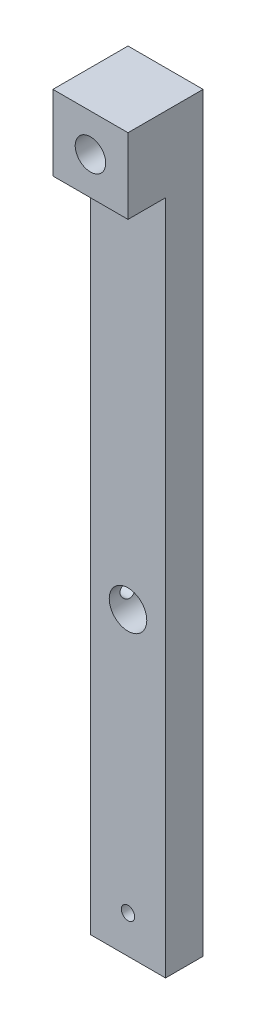
ISO-10303-21;
HEADER;
FILE_DESCRIPTION(('STEP AP214'),'2;1');
FILE_NAME('part.step','',(''),(''),'','','');
FILE_SCHEMA(('AUTOMOTIVE_DESIGN { 1 0 10303 214 1 1 1 1 }'));
ENDSEC;
DATA;
#1=APPLICATION_CONTEXT('core data for automotive mechanical design processes');
#2=APPLICATION_PROTOCOL_DEFINITION('international standard','automotive_design',2000,#1);
#3=PRODUCT_CONTEXT('',#1,'mechanical');
#4=PRODUCT('Part','Part','',(#3));
#5=PRODUCT_RELATED_PRODUCT_CATEGORY('part','',(#4));
#6=PRODUCT_DEFINITION_FORMATION('','',#4);
#7=PRODUCT_DEFINITION_CONTEXT('part definition',#1,'design');
#8=PRODUCT_DEFINITION('design','',#6,#7);
#9=PRODUCT_DEFINITION_SHAPE('','',#8);
#10=(LENGTH_UNIT() NAMED_UNIT(*) SI_UNIT(.MILLI.,.METRE.));
#11=(NAMED_UNIT(*) PLANE_ANGLE_UNIT() SI_UNIT($,.RADIAN.));
#12=(NAMED_UNIT(*) SI_UNIT($,.STERADIAN.) SOLID_ANGLE_UNIT());
#13=UNCERTAINTY_MEASURE_WITH_UNIT(LENGTH_MEASURE(1.E-05),#10,'distance_accuracy_value','');
#14=(GEOMETRIC_REPRESENTATION_CONTEXT(3) GLOBAL_UNCERTAINTY_ASSIGNED_CONTEXT((#13)) GLOBAL_UNIT_ASSIGNED_CONTEXT((#10,
#11,#12)) REPRESENTATION_CONTEXT('',''));
#15=CARTESIAN_POINT('',(0.,0.,0.));
#16=DIRECTION('',(0.,0.,1.));
#17=DIRECTION('',(1.,0.,0.));
#18=AXIS2_PLACEMENT_3D('',#15,#16,#17);
#19=CARTESIAN_POINT('',(6.34999999999999,63.5,6.35));
#20=DIRECTION('',(-1.,0.,0.));
#21=DIRECTION('',(0.,-1.,0.));
#22=AXIS2_PLACEMENT_3D('',#19,#20,#21);
#23=PLANE('',#22);
#24=DIRECTION('',(0.,1.,0.));
#25=VECTOR('',#24,1.);
#26=CARTESIAN_POINT('',(6.34999999999999,63.5,0.));
#27=LINE('',#26,#25);
#28=CARTESIAN_POINT('',(6.35,-63.5,0.));
#29=VERTEX_POINT('',#28);
#30=CARTESIAN_POINT('',(6.34999999999999,63.5,0.));
#31=VERTEX_POINT('',#30);
#32=EDGE_CURVE('E95',#29,#31,#27,.T.);
#33=ORIENTED_EDGE('',*,*,#32,.T.);
#34=DIRECTION('',(0.,0.,-1.));
#35=VECTOR('',#34,1.);
#36=CARTESIAN_POINT('',(6.34999999999999,63.5,6.35));
#37=LINE('',#36,#35);
#38=CARTESIAN_POINT('',(6.35,63.5,12.7));
#39=VERTEX_POINT('',#38);
#40=EDGE_CURVE('E12',#39,#31,#37,.T.);
#41=ORIENTED_EDGE('',*,*,#40,.F.);
#42=DIRECTION('',(0.,1.,0.));
#43=VECTOR('',#42,1.);
#44=CARTESIAN_POINT('',(6.35,63.5,12.7));
#45=LINE('',#44,#43);
#46=CARTESIAN_POINT('',(6.35,50.8,12.7));
#47=VERTEX_POINT('',#46);
#48=EDGE_CURVE('E134',#47,#39,#45,.T.);
#49=ORIENTED_EDGE('',*,*,#48,.F.);
#50=DIRECTION('',(0.,0.,-1.));
#51=VECTOR('',#50,1.);
#52=CARTESIAN_POINT('',(6.35,50.8,12.7));
#53=LINE('',#52,#51);
#54=CARTESIAN_POINT('',(6.35,50.8,6.35));
#55=VERTEX_POINT('',#54);
#56=EDGE_CURVE('E104',#47,#55,#53,.T.);
#57=ORIENTED_EDGE('',*,*,#56,.T.);
#58=DIRECTION('',(0.,1.,0.));
#59=VECTOR('',#58,1.);
#60=CARTESIAN_POINT('',(6.34999999999999,63.5,6.35));
#61=LINE('',#60,#59);
#62=CARTESIAN_POINT('',(6.35,-63.5,6.35));
#63=VERTEX_POINT('',#62);
#64=EDGE_CURVE('E89',#63,#55,#61,.T.);
#65=ORIENTED_EDGE('',*,*,#64,.F.);
#66=DIRECTION('',(0.,0.,-1.));
#67=VECTOR('',#66,1.);
#68=CARTESIAN_POINT('',(6.35,-63.5,6.35));
#69=LINE('',#68,#67);
#70=EDGE_CURVE('E82',#63,#29,#69,.T.);
#71=ORIENTED_EDGE('',*,*,#70,.T.);
#72=EDGE_LOOP('',(#33,#41,#49,#57,#65,#71));
#73=FACE_BOUND('',#72,.T.);
#74=ADVANCED_FACE('F38',(#73),#23,.F.);
#75=CARTESIAN_POINT('',(-6.35000000000001,63.5,6.35));
#76=DIRECTION('',(0.,-1.,0.));
#77=DIRECTION('',(0.,0.,-1.));
#78=AXIS2_PLACEMENT_3D('',#75,#76,#77);
#79=PLANE('',#78);
#80=DIRECTION('',(-1.,0.,0.));
#81=VECTOR('',#80,1.);
#82=CARTESIAN_POINT('',(-6.35000000000001,63.5,0.));
#83=LINE('',#82,#81);
#84=CARTESIAN_POINT('',(-6.35000000000001,63.5,0.));
#85=VERTEX_POINT('',#84);
#86=EDGE_CURVE('E99',#31,#85,#83,.T.);
#87=ORIENTED_EDGE('',*,*,#86,.T.);
#88=DIRECTION('',(0.,0.,-1.));
#89=VECTOR('',#88,1.);
#90=CARTESIAN_POINT('',(-6.35000000000001,63.5,6.35));
#91=LINE('',#90,#89);
#92=CARTESIAN_POINT('',(-6.35000000000001,63.5,12.7));
#93=VERTEX_POINT('',#92);
#94=EDGE_CURVE('E46',#93,#85,#91,.T.);
#95=ORIENTED_EDGE('',*,*,#94,.F.);
#96=DIRECTION('',(-1.,0.,0.));
#97=VECTOR('',#96,1.);
#98=CARTESIAN_POINT('',(-6.35000000000001,63.5,12.7));
#99=LINE('',#98,#97);
#100=EDGE_CURVE('E122',#39,#93,#99,.T.);
#101=ORIENTED_EDGE('',*,*,#100,.F.);
#102=ORIENTED_EDGE('',*,*,#40,.T.);
#103=EDGE_LOOP('',(#87,#95,#101,#102));
#104=FACE_BOUND('',#103,.T.);
#105=ADVANCED_FACE('F183',(#104),#79,.F.);
#106=CARTESIAN_POINT('',(-6.35000000000001,63.5,6.35));
#107=DIRECTION('',(1.,0.,0.));
#108=DIRECTION('',(0.,1.,0.));
#109=AXIS2_PLACEMENT_3D('',#106,#107,#108);
#110=PLANE('',#109);
#111=CARTESIAN_POINT('',(-6.35,-12.7,3.175));
#112=DIRECTION('',(-1.,0.,0.));
#113=DIRECTION('',(0.,0.,1.));
#114=AXIS2_PLACEMENT_3D('',#111,#112,#113);
#115=CIRCLE('',#114,1.35255);
#116=CARTESIAN_POINT('',(-6.35,-12.7,4.52755));
#117=VERTEX_POINT('',#116);
#118=EDGE_CURVE('E167',#117,#117,#115,.T.);
#119=ORIENTED_EDGE('',*,*,#118,.F.);
#120=EDGE_LOOP('',(#119));
#121=FACE_BOUND('',#120,.T.);
#122=DIRECTION('',(0.,-1.,0.));
#123=VECTOR('',#122,1.);
#124=CARTESIAN_POINT('',(-6.35000000000001,63.5,0.));
#125=LINE('',#124,#123);
#126=CARTESIAN_POINT('',(-6.35,-63.5,0.));
#127=VERTEX_POINT('',#126);
#128=EDGE_CURVE('E90',#85,#127,#125,.T.);
#129=ORIENTED_EDGE('',*,*,#128,.T.);
#130=DIRECTION('',(0.,0.,-1.));
#131=VECTOR('',#130,1.);
#132=CARTESIAN_POINT('',(-6.35,-63.5,6.35));
#133=LINE('',#132,#131);
#134=CARTESIAN_POINT('',(-6.35,-63.5,6.35));
#135=VERTEX_POINT('',#134);
#136=EDGE_CURVE('E85',#135,#127,#133,.T.);
#137=ORIENTED_EDGE('',*,*,#136,.F.);
#138=DIRECTION('',(0.,-1.,0.));
#139=VECTOR('',#138,1.);
#140=CARTESIAN_POINT('',(-6.35000000000001,63.5,6.35));
#141=LINE('',#140,#139);
#142=CARTESIAN_POINT('',(-6.35000000000001,50.8,6.35));
#143=VERTEX_POINT('',#142);
#144=EDGE_CURVE('E115',#143,#135,#141,.T.);
#145=ORIENTED_EDGE('',*,*,#144,.F.);
#146=DIRECTION('',(0.,0.,-1.));
#147=VECTOR('',#146,1.);
#148=CARTESIAN_POINT('',(-6.35000000000001,50.8,12.7));
#149=LINE('',#148,#147);
#150=CARTESIAN_POINT('',(-6.35000000000001,50.8,12.7));
#151=VERTEX_POINT('',#150);
#152=EDGE_CURVE('E100',#151,#143,#149,.T.);
#153=ORIENTED_EDGE('',*,*,#152,.F.);
#154=DIRECTION('',(0.,-1.,0.));
#155=VECTOR('',#154,1.);
#156=CARTESIAN_POINT('',(-6.35000000000001,63.5,12.7));
#157=LINE('',#156,#155);
#158=EDGE_CURVE('E125',#93,#151,#157,.T.);
#159=ORIENTED_EDGE('',*,*,#158,.F.);
#160=ORIENTED_EDGE('',*,*,#94,.T.);
#161=EDGE_LOOP('',(#129,#137,#145,#153,#159,#160));
#162=FACE_BOUND('',#161,.T.);
#163=ADVANCED_FACE('F187',(#121,#162),#110,.F.);
#164=CARTESIAN_POINT('',(-6.35,-63.5,6.35));
#165=DIRECTION('',(0.,1.,0.));
#166=DIRECTION('',(0.,0.,1.));
#167=AXIS2_PLACEMENT_3D('',#164,#165,#166);
#168=PLANE('',#167);
#169=DIRECTION('',(1.,0.,0.));
#170=VECTOR('',#169,1.);
#171=CARTESIAN_POINT('',(-6.35,-63.5,0.));
#172=LINE('',#171,#170);
#173=EDGE_CURVE('E79',#127,#29,#172,.T.);
#174=ORIENTED_EDGE('',*,*,#173,.T.);
#175=ORIENTED_EDGE('',*,*,#70,.F.);
#176=DIRECTION('',(1.,0.,0.));
#177=VECTOR('',#176,1.);
#178=CARTESIAN_POINT('',(-6.35,-63.5,6.35));
#179=LINE('',#178,#177);
#180=EDGE_CURVE('E60',#135,#63,#179,.T.);
#181=ORIENTED_EDGE('',*,*,#180,.F.);
#182=ORIENTED_EDGE('',*,*,#136,.T.);
#183=EDGE_LOOP('',(#174,#175,#181,#182));
#184=FACE_BOUND('',#183,.T.);
#185=ADVANCED_FACE('F81',(#184),#168,.F.);
#186=CARTESIAN_POINT('',(6.35,-63.5,6.35));
#187=DIRECTION('',(0.,0.,1.));
#188=DIRECTION('',(1.,0.,0.));
#189=AXIS2_PLACEMENT_3D('',#186,#187,#188);
#190=PLANE('',#189);
#191=CARTESIAN_POINT('',(0.,-57.15,6.35));
#192=DIRECTION('',(0.,0.,1.));
#193=DIRECTION('',(1.,0.,0.));
#194=AXIS2_PLACEMENT_3D('',#191,#192,#193);
#195=CIRCLE('',#194,1.13029999999999);
#196=CARTESIAN_POINT('',(1.1303,-57.15,6.35));
#197=VERTEX_POINT('',#196);
#198=EDGE_CURVE('E41',#197,#197,#195,.T.);
#199=ORIENTED_EDGE('',*,*,#198,.F.);
#200=EDGE_LOOP('',(#199));
#201=FACE_BOUND('',#200,.T.);
#202=CARTESIAN_POINT('',(0.,-12.7,6.35));
#203=DIRECTION('',(0.,0.,1.));
#204=DIRECTION('',(1.,0.,0.));
#205=AXIS2_PLACEMENT_3D('',#202,#203,#204);
#206=CIRCLE('',#205,3.175);
#207=CARTESIAN_POINT('',(3.17499999999999,-12.7,6.35));
#208=VERTEX_POINT('',#207);
#209=EDGE_CURVE('E126',#208,#208,#206,.T.);
#210=ORIENTED_EDGE('',*,*,#209,.F.);
#211=EDGE_LOOP('',(#210));
#212=FACE_BOUND('',#211,.T.);
#213=DIRECTION('',(1.,0.,0.));
#214=VECTOR('',#213,1.);
#215=CARTESIAN_POINT('',(-6.35000000000001,50.8,6.35));
#216=LINE('',#215,#214);
#217=EDGE_CURVE('E54',#143,#55,#216,.T.);
#218=ORIENTED_EDGE('',*,*,#217,.F.);
#219=ORIENTED_EDGE('',*,*,#144,.T.);
#220=ORIENTED_EDGE('',*,*,#180,.T.);
#221=ORIENTED_EDGE('',*,*,#64,.T.);
#222=EDGE_LOOP('',(#218,#219,#220,#221));
#223=FACE_BOUND('',#222,.T.);
#224=ADVANCED_FACE('F197',(#201,#212,#223),#190,.T.);
#225=CARTESIAN_POINT('',(6.35,-63.5,0.));
#226=DIRECTION('',(0.,0.,1.));
#227=DIRECTION('',(1.,0.,0.));
#228=AXIS2_PLACEMENT_3D('',#225,#226,#227);
#229=PLANE('',#228);
#230=CARTESIAN_POINT('',(0.,57.15,0.));
#231=DIRECTION('',(0.,0.,1.));
#232=DIRECTION('',(1.,0.,0.));
#233=AXIS2_PLACEMENT_3D('',#230,#231,#232);
#234=CIRCLE('',#233,2.5796875);
#235=CARTESIAN_POINT('',(2.5796875,57.15,0.));
#236=VERTEX_POINT('',#235);
#237=EDGE_CURVE('E154',#236,#236,#234,.T.);
#238=ORIENTED_EDGE('',*,*,#237,.T.);
#239=EDGE_LOOP('',(#238));
#240=FACE_BOUND('',#239,.T.);
#241=CARTESIAN_POINT('',(0.,-57.15,0.));
#242=DIRECTION('',(0.,0.,-1.));
#243=DIRECTION('',(-1.,0.,0.));
#244=AXIS2_PLACEMENT_3D('',#241,#242,#243);
#245=CIRCLE('',#244,1.13029999999999);
#246=CARTESIAN_POINT('',(-1.13029999999998,-57.15,0.));
#247=VERTEX_POINT('',#246);
#248=EDGE_CURVE('E151',#247,#247,#245,.T.);
#249=ORIENTED_EDGE('',*,*,#248,.F.);
#250=EDGE_LOOP('',(#249));
#251=FACE_BOUND('',#250,.T.);
#252=CARTESIAN_POINT('',(0.,-12.7,0.));
#253=DIRECTION('',(0.,0.,-1.));
#254=DIRECTION('',(-1.,0.,0.));
#255=AXIS2_PLACEMENT_3D('',#252,#253,#254);
#256=CIRCLE('',#255,3.175);
#257=CARTESIAN_POINT('',(-3.17500000000001,-12.7,0.));
#258=VERTEX_POINT('',#257);
#259=EDGE_CURVE('E148',#258,#258,#256,.T.);
#260=ORIENTED_EDGE('',*,*,#259,.F.);
#261=EDGE_LOOP('',(#260));
#262=FACE_BOUND('',#261,.T.);
#263=ORIENTED_EDGE('',*,*,#32,.F.);
#264=ORIENTED_EDGE('',*,*,#173,.F.);
#265=ORIENTED_EDGE('',*,*,#128,.F.);
#266=ORIENTED_EDGE('',*,*,#86,.F.);
#267=EDGE_LOOP('',(#263,#264,#265,#266));
#268=FACE_BOUND('',#267,.T.);
#269=ADVANCED_FACE('F98',(#240,#251,#262,#268),#229,.F.);
#270=CARTESIAN_POINT('',(-6.35000000000001,50.8,12.7));
#271=DIRECTION('',(0.,1.,0.));
#272=DIRECTION('',(0.,0.,1.));
#273=AXIS2_PLACEMENT_3D('',#270,#271,#272);
#274=PLANE('',#273);
#275=ORIENTED_EDGE('',*,*,#217,.T.);
#276=ORIENTED_EDGE('',*,*,#56,.F.);
#277=DIRECTION('',(1.,0.,0.));
#278=VECTOR('',#277,1.);
#279=CARTESIAN_POINT('',(-6.35000000000001,50.8,12.7));
#280=LINE('',#279,#278);
#281=EDGE_CURVE('E140',#151,#47,#280,.T.);
#282=ORIENTED_EDGE('',*,*,#281,.F.);
#283=ORIENTED_EDGE('',*,*,#152,.T.);
#284=EDGE_LOOP('',(#275,#276,#282,#283));
#285=FACE_BOUND('',#284,.T.);
#286=ADVANCED_FACE('F200',(#285),#274,.F.);
#287=CARTESIAN_POINT('',(-6.35000000000001,50.8,12.7));
#288=DIRECTION('',(0.,0.,1.));
#289=DIRECTION('',(1.,0.,0.));
#290=AXIS2_PLACEMENT_3D('',#287,#288,#289);
#291=PLANE('',#290);
#292=CARTESIAN_POINT('',(0.,57.15,12.7));
#293=DIRECTION('',(0.,0.,1.));
#294=DIRECTION('',(1.,0.,0.));
#295=AXIS2_PLACEMENT_3D('',#292,#293,#294);
#296=CIRCLE('',#295,2.5796875);
#297=CARTESIAN_POINT('',(2.5796875,57.15,12.7));
#298=VERTEX_POINT('',#297);
#299=EDGE_CURVE('E155',#298,#298,#296,.T.);
#300=ORIENTED_EDGE('',*,*,#299,.F.);
#301=EDGE_LOOP('',(#300));
#302=FACE_BOUND('',#301,.T.);
#303=ORIENTED_EDGE('',*,*,#158,.T.);
#304=ORIENTED_EDGE('',*,*,#281,.T.);
#305=ORIENTED_EDGE('',*,*,#48,.T.);
#306=ORIENTED_EDGE('',*,*,#100,.T.);
#307=EDGE_LOOP('',(#303,#304,#305,#306));
#308=FACE_BOUND('',#307,.T.);
#309=ADVANCED_FACE('F207',(#302,#308),#291,.T.);
#310=CARTESIAN_POINT('',(0.,-12.7,12.700025));
#311=DIRECTION('',(0.,0.,-1.));
#312=DIRECTION('',(-1.,0.,0.));
#313=AXIS2_PLACEMENT_3D('',#310,#311,#312);
#314=CYLINDRICAL_SURFACE('',#313,3.175);
#315=CARTESIAN_POINT('',(-3.17500000000001,-12.7,4.52755));
#316=CARTESIAN_POINT('',(-3.17499376427411,-12.6276880196817,4.52754177520317));
#317=CARTESIAN_POINT('',(-3.17250122265996,-12.5552696440306,4.52171677085276));
#318=CARTESIAN_POINT('',(-3.16277066799622,-12.4124917469307,4.49862700946327));
#319=CARTESIAN_POINT('',(-3.15552058505165,-12.3421379388427,4.48133315473188));
#320=CARTESIAN_POINT('',(-3.13705242394938,-12.2057910600776,4.43606652134826));
#321=CARTESIAN_POINT('',(-3.12584804282757,-12.1397838583136,4.40813057893921));
#322=CARTESIAN_POINT('',(-3.10055518102151,-12.013459192363,4.34252831329107));
#323=CARTESIAN_POINT('',(-3.08646750190971,-11.9531401536297,4.30486469363826));
#324=CARTESIAN_POINT('',(-3.05599084668589,-11.8366693784465,4.2188105223501));
#325=CARTESIAN_POINT('',(-3.03952431771545,-11.7808519570063,4.16999522263455));
#326=CARTESIAN_POINT('',(-3.00647271455962,-11.6779062002602,4.06392253623825));
#327=CARTESIAN_POINT('',(-2.98988758046312,-11.6307826340461,4.00666054685898));
#328=CARTESIAN_POINT('',(-2.95750917471474,-11.544138113496,3.88171614571851));
#329=CARTESIAN_POINT('',(-2.94180185247633,-11.5051395512333,3.81364683913289));
#330=CARTESIAN_POINT('',(-2.9141949309884,-11.4392950021161,3.67115021576441));
#331=CARTESIAN_POINT('',(-2.9022932838985,-11.4124424762224,3.59672634579415));
#332=CARTESIAN_POINT('',(-2.88448854081884,-11.3730486282676,3.44748178209826));
#333=CARTESIAN_POINT('',(-2.87831670118837,-11.3598623341918,3.37286466649272));
#334=CARTESIAN_POINT('',(-2.87190163928983,-11.3461649433191,3.22224141107698));
#335=CARTESIAN_POINT('',(-2.87165493063135,-11.3456463927264,3.14623611443425));
#336=CARTESIAN_POINT('',(-2.876891622832,-11.3568150411749,3.00155646216194));
#337=CARTESIAN_POINT('',(-2.88191351336427,-11.3675191280776,2.93278608927004));
#338=CARTESIAN_POINT('',(-2.89633861211709,-11.3991745117954,2.79813102087289));
#339=CARTESIAN_POINT('',(-2.9057427050121,-11.4201278777667,2.7322469109829));
#340=CARTESIAN_POINT('',(-2.92808748949867,-11.4720991263163,2.60353272243311));
#341=CARTESIAN_POINT('',(-2.94110054344016,-11.5033256781117,2.54080002824039));
#342=CARTESIAN_POINT('',(-2.96918199373292,-11.5748086219111,2.42121377419416));
#343=CARTESIAN_POINT('',(-2.98425121955487,-11.6150686623179,2.36436260333507));
#344=CARTESIAN_POINT('',(-3.01637253593643,-11.7076660500718,2.25284411343625));
#345=CARTESIAN_POINT('',(-3.0334819320518,-11.7607580049607,2.19881804789814));
#346=CARTESIAN_POINT('',(-3.06663259637419,-11.8754101608348,2.10021552840122));
#347=CARTESIAN_POINT('',(-3.08267359069276,-11.9369725209319,2.05564149115567));
#348=CARTESIAN_POINT('',(-3.11238486879189,-12.0688420013959,1.97620918261834));
#349=CARTESIAN_POINT('',(-3.12598548270223,-12.1393299354395,1.94162308137786));
#350=CARTESIAN_POINT('',(-3.14874388156017,-12.2858514030737,1.88502704250685));
#351=CARTESIAN_POINT('',(-3.15790423558694,-12.3618817005546,1.86300983135907));
#352=CARTESIAN_POINT('',(-3.17026332558043,-12.5119805476647,1.83354491934094));
#353=CARTESIAN_POINT('',(-3.17381325962293,-12.5858513821304,1.8252373446985));
#354=CARTESIAN_POINT('',(-3.17568105366637,-12.7340114282148,1.82084992680005));
#355=CARTESIAN_POINT('',(-3.17400050350428,-12.8083005058543,1.82476636798234));
#356=CARTESIAN_POINT('',(-3.16582243599865,-12.9510863659455,1.84411043997587));
#357=CARTESIAN_POINT('',(-3.15958185757469,-13.019682718417,1.85892433271249));
#358=CARTESIAN_POINT('',(-3.14319082038793,-13.1533351152465,1.89877756726435));
#359=CARTESIAN_POINT('',(-3.13303987341455,-13.2183907163827,1.92381818591264));
#360=CARTESIAN_POINT('',(-3.10940117061926,-13.345410792119,1.98422832667114));
#361=CARTESIAN_POINT('',(-3.0958191739096,-13.4072154593705,2.01989577974538));
#362=CARTESIAN_POINT('',(-3.06675439613933,-13.5241848797948,2.10022103608394));
#363=CARTESIAN_POINT('',(-3.05127080824473,-13.5793467946904,2.14488266069994));
#364=CARTESIAN_POINT('',(-3.01863676563667,-13.6857907787246,2.24581760274854));
#365=CARTESIAN_POINT('',(-3.00144808863403,-13.7364772307765,2.30270827444718));
#366=CARTESIAN_POINT('',(-2.96835692538156,-13.8277612268482,2.42444302368866));
#367=CARTESIAN_POINT('',(-2.95245478278207,-13.8683560812314,2.48928921469234));
#368=CARTESIAN_POINT('',(-2.92358303045919,-13.9388581285946,2.62665757409286));
#369=CARTESIAN_POINT('',(-2.91066826625579,-13.9685705211025,2.69929211735658));
#370=CARTESIAN_POINT('',(-2.88995701757538,-14.0150792800295,2.84925935932626));
#371=CARTESIAN_POINT('',(-2.88215605454429,-14.0318869503345,2.92658788211574));
#372=CARTESIAN_POINT('',(-2.87326066425686,-14.05096216089,3.0771089835159));
#373=CARTESIAN_POINT('',(-2.87168133184629,-14.0542816698903,3.15014007908179));
#374=CARTESIAN_POINT('',(-2.87410980516819,-14.0491206696799,3.29568163722144));
#375=CARTESIAN_POINT('',(-2.8781166548405,-14.0406421796659,3.36819218675054));
#376=CARTESIAN_POINT('',(-2.89081435572086,-14.0130225522413,3.50682444023977));
#377=CARTESIAN_POINT('',(-2.89925667251006,-13.9944455161329,3.57308352632024));
#378=CARTESIAN_POINT('',(-2.91966810669132,-13.9477217508213,3.70155240125548));
#379=CARTESIAN_POINT('',(-2.93163822413925,-13.9195723076973,3.76376103578051));
#380=CARTESIAN_POINT('',(-2.95866974170817,-13.8525103667155,3.88654945594293));
#381=CARTESIAN_POINT('',(-2.9738761215368,-13.8130417786036,3.94679297640017));
#382=CARTESIAN_POINT('',(-3.00528179589944,-13.7252216749938,4.06013050272946));
#383=CARTESIAN_POINT('',(-3.02148145772031,-13.6768668602661,4.11322184044812));
#384=CARTESIAN_POINT('',(-3.05455722211637,-13.5681998600487,4.21499082551859));
#385=CARTESIAN_POINT('',(-3.07138832065965,-13.5072510961453,4.26300664347723));
#386=CARTESIAN_POINT('',(-3.10257916482517,-13.3775470329477,4.34817457940271));
#387=CARTESIAN_POINT('',(-3.11693778833813,-13.3087882125042,4.38532177006529));
#388=CARTESIAN_POINT('',(-3.14138312017249,-13.1663492447202,4.44694468564941));
#389=CARTESIAN_POINT('',(-3.15153079407948,-13.0927586018353,4.47160247811649));
#390=CARTESIAN_POINT('',(-3.16665584269733,-12.9420782838541,4.50795039769719));
#391=CARTESIAN_POINT('',(-3.17164926980854,-12.865000257484,4.51968079369904));
#392=CARTESIAN_POINT('',(-3.17459936321148,-12.7584013278768,4.52660755828299));
#393=CARTESIAN_POINT('',(-3.1750025188283,-12.7292093438574,4.52755332228377));
#394=CARTESIAN_POINT('',(-3.17500000000001,-12.7,4.52755));
#395=B_SPLINE_CURVE_WITH_KNOTS('',3,(#315,#316,#317,#318,#319,#320,#321,#322,#323,#324,#325,
#326,#327,#328,#329,#330,#331,#332,#333,#334,#335,#336,#337,#338,#339,#340,#341,#342,#343,#344,
#345,#346,#347,#348,#349,#350,#351,#352,#353,#354,#355,#356,#357,#358,#359,#360,#361,#362,#363,
#364,#365,#366,#367,#368,#369,#370,#371,#372,#373,#374,#375,#376,#377,#378,#379,#380,#381,#382,
#383,#384,#385,#386,#387,#388,#389,#390,#391,#392,#393,#394),.UNSPECIFIED.,.T.,.F.,(4,2,2,2,2,2,
2,2,2,2,2,2,2,2,2,2,2,2,2,2,2,2,2,2,2,2,2,2,2,2,2,2,2,2,2,2,2,2,2,4),(0.,0.216850050638945,
0.434252388523417,0.650908954368242,0.867505370130753,1.09439609589244,1.32141091689532,
1.56022386511507,1.79890809057365,2.02572902648839,2.25241649603317,2.46078251280768,
2.66919061253204,2.88212426261053,3.0951440666222,3.32706321416167,3.55904158793932,
3.79684693152949,4.03451451918156,4.25661426582137,4.47864651050859,4.68904802527598,
4.89947581724865,5.11647002970509,5.33355663169255,5.56682347195774,5.80015241655904,
6.03747459229678,6.27458864785546,6.49280702774581,6.71098806472672,6.91807492424948,
7.12522054501713,7.34512352029504,7.56510830550803,7.80215736760165,8.0393137302226,
8.27290548905712,8.50576753373726,8.59336087119996),.UNSPECIFIED.);
#396=CARTESIAN_POINT('',(-3.17500000000001,-12.7,4.52755));
#397=VERTEX_POINT('',#396);
#398=EDGE_CURVE('E158',#397,#397,#395,.T.);
#399=ORIENTED_EDGE('',*,*,#398,.T.);
#400=EDGE_LOOP('',(#399));
#401=FACE_BOUND('',#400,.T.);
#402=ORIENTED_EDGE('',*,*,#209,.T.);
#403=EDGE_LOOP('',(#402));
#404=FACE_BOUND('',#403,.T.);
#405=ORIENTED_EDGE('',*,*,#259,.T.);
#406=EDGE_LOOP('',(#405));
#407=FACE_BOUND('',#406,.T.);
#408=ADVANCED_FACE('F211',(#401,#404,#407),#314,.F.);
#409=CARTESIAN_POINT('',(0.,-57.15,0.));
#410=DIRECTION('',(0.,0.,-1.));
#411=DIRECTION('',(-1.,0.,0.));
#412=AXIS2_PLACEMENT_3D('',#409,#410,#411);
#413=CYLINDRICAL_SURFACE('',#412,1.13029999999999);
#414=ORIENTED_EDGE('',*,*,#198,.T.);
#415=EDGE_LOOP('',(#414));
#416=FACE_BOUND('',#415,.T.);
#417=ORIENTED_EDGE('',*,*,#248,.T.);
#418=EDGE_LOOP('',(#417));
#419=FACE_BOUND('',#418,.T.);
#420=ADVANCED_FACE('F178',(#416,#419),#413,.F.);
#421=CARTESIAN_POINT('',(0.,57.15,0.));
#422=DIRECTION('',(0.,0.,1.));
#423=DIRECTION('',(1.,0.,0.));
#424=AXIS2_PLACEMENT_3D('',#421,#422,#423);
#425=CYLINDRICAL_SURFACE('',#424,2.5796875);
#426=CARTESIAN_POINT('',(2.5796875,57.15,0.));
#427=CARTESIAN_POINT('',(2.5796875,57.15,0.132291666666665));
#428=CARTESIAN_POINT('',(2.5796875,57.15,0.264583333333332));
#429=CARTESIAN_POINT('',(2.5796875,57.15,0.529166666666665));
#430=CARTESIAN_POINT('',(2.5796875,57.15,0.661458333333332));
#431=CARTESIAN_POINT('',(2.5796875,57.15,0.926041666666665));
#432=CARTESIAN_POINT('',(2.5796875,57.15,1.05833333333333));
#433=CARTESIAN_POINT('',(2.5796875,57.15,1.32291666666666));
#434=CARTESIAN_POINT('',(2.5796875,57.15,1.45520833333333));
#435=CARTESIAN_POINT('',(2.5796875,57.15,1.71979166666667));
#436=CARTESIAN_POINT('',(2.5796875,57.15,1.85208333333333));
#437=CARTESIAN_POINT('',(2.5796875,57.15,2.11666666666666));
#438=CARTESIAN_POINT('',(2.5796875,57.15,2.24895833333333));
#439=CARTESIAN_POINT('',(2.5796875,57.15,2.51354166666667));
#440=CARTESIAN_POINT('',(2.5796875,57.15,2.64583333333333));
#441=CARTESIAN_POINT('',(2.5796875,57.15,2.91041666666667));
#442=CARTESIAN_POINT('',(2.5796875,57.15,3.04270833333333));
#443=CARTESIAN_POINT('',(2.5796875,57.15,3.30729166666667));
#444=CARTESIAN_POINT('',(2.5796875,57.15,3.43958333333333));
#445=CARTESIAN_POINT('',(2.5796875,57.15,3.70416666666667));
#446=CARTESIAN_POINT('',(2.5796875,57.15,3.83645833333333));
#447=CARTESIAN_POINT('',(2.5796875,57.15,4.10104166666667));
#448=CARTESIAN_POINT('',(2.5796875,57.15,4.23333333333333));
#449=CARTESIAN_POINT('',(2.5796875,57.15,4.49791666666667));
#450=CARTESIAN_POINT('',(2.5796875,57.15,4.63020833333333));
#451=CARTESIAN_POINT('',(2.5796875,57.15,4.89479166666667));
#452=CARTESIAN_POINT('',(2.5796875,57.15,5.02708333333333));
#453=CARTESIAN_POINT('',(2.5796875,57.15,5.29166666666667));
#454=CARTESIAN_POINT('',(2.5796875,57.15,5.42395833333333));
#455=CARTESIAN_POINT('',(2.5796875,57.15,5.68854166666667));
#456=CARTESIAN_POINT('',(2.5796875,57.15,5.82083333333333));
#457=CARTESIAN_POINT('',(2.5796875,57.15,6.08541666666667));
#458=CARTESIAN_POINT('',(2.5796875,57.15,6.21770833333333));
#459=CARTESIAN_POINT('',(2.5796875,57.15,6.48229166666667));
#460=CARTESIAN_POINT('',(2.5796875,57.15,6.61458333333333));
#461=CARTESIAN_POINT('',(2.5796875,57.15,6.87916666666667));
#462=CARTESIAN_POINT('',(2.5796875,57.15,7.01145833333333));
#463=CARTESIAN_POINT('',(2.5796875,57.15,7.27604166666667));
#464=CARTESIAN_POINT('',(2.5796875,57.15,7.40833333333333));
#465=CARTESIAN_POINT('',(2.5796875,57.15,7.67291666666667));
#466=CARTESIAN_POINT('',(2.5796875,57.15,7.80520833333333));
#467=CARTESIAN_POINT('',(2.5796875,57.15,8.06979166666666));
#468=CARTESIAN_POINT('',(2.5796875,57.15,8.20208333333333));
#469=CARTESIAN_POINT('',(2.5796875,57.15,8.46666666666667));
#470=CARTESIAN_POINT('',(2.5796875,57.15,8.59895833333333));
#471=CARTESIAN_POINT('',(2.5796875,57.15,8.86354166666666));
#472=CARTESIAN_POINT('',(2.5796875,57.15,8.99583333333333));
#473=CARTESIAN_POINT('',(2.5796875,57.15,9.26041666666666));
#474=CARTESIAN_POINT('',(2.5796875,57.15,9.39270833333333));
#475=CARTESIAN_POINT('',(2.5796875,57.15,9.65729166666666));
#476=CARTESIAN_POINT('',(2.5796875,57.15,9.78958333333333));
#477=CARTESIAN_POINT('',(2.5796875,57.15,10.0541666666667));
#478=CARTESIAN_POINT('',(2.5796875,57.15,10.1864583333333));
#479=CARTESIAN_POINT('',(2.5796875,57.15,10.4510416666667));
#480=CARTESIAN_POINT('',(2.5796875,57.15,10.5833333333333));
#481=CARTESIAN_POINT('',(2.5796875,57.15,10.8479166666667));
#482=CARTESIAN_POINT('',(2.5796875,57.15,10.9802083333333));
#483=CARTESIAN_POINT('',(2.5796875,57.15,11.2447916666667));
#484=CARTESIAN_POINT('',(2.5796875,57.15,11.3770833333333));
#485=CARTESIAN_POINT('',(2.5796875,57.15,11.6416666666667));
#486=CARTESIAN_POINT('',(2.5796875,57.15,11.7739583333333));
#487=CARTESIAN_POINT('',(2.5796875,57.15,12.0385416666667));
#488=CARTESIAN_POINT('',(2.5796875,57.15,12.1708333333333));
#489=CARTESIAN_POINT('',(2.5796875,57.15,12.4354166666667));
#490=CARTESIAN_POINT('',(2.5796875,57.15,12.5677083333333));
#491=CARTESIAN_POINT('',(2.5796875,57.15,12.7));
#492=B_SPLINE_CURVE_WITH_KNOTS('',3,(#426,#427,#428,#429,#430,#431,#432,#433,#434,#435,#436,
#437,#438,#439,#440,#441,#442,#443,#444,#445,#446,#447,#448,#449,#450,#451,#452,#453,#454,#455,
#456,#457,#458,#459,#460,#461,#462,#463,#464,#465,#466,#467,#468,#469,#470,#471,#472,#473,#474,
#475,#476,#477,#478,#479,#480,#481,#482,#483,#484,#485,#486,#487,#488,#489,#490,#491),
.UNSPECIFIED.,.F.,.F.,(4,2,2,2,2,2,2,2,2,2,2,2,2,2,2,2,2,2,2,2,2,2,2,2,2,2,2,2,2,2,2,2,4),(0.,
0.396875,0.79375,1.190625,1.5875,1.984375,2.38125,2.778125,3.175,3.571875,3.96875,4.365625,
4.7625,5.159375,5.55625,5.953125,6.35,6.746875,7.14375,7.540625,7.9375,8.334375,8.73125,
9.128125,9.525,9.921875,10.31875,10.715625,11.1125,11.509375,11.90625,12.303125,12.7),.UNSPECIFIED.);
#493=EDGE_CURVE('BSEAM173',#236,#298,#492,.T.);
#494=ORIENTED_EDGE('',*,*,#237,.F.);
#495=ORIENTED_EDGE('',*,*,#299,.T.);
#496=ORIENTED_EDGE('',*,*,#493,.T.);
#497=ORIENTED_EDGE('',*,*,#493,.F.);
#498=EDGE_LOOP('',(#494,#496,#495,#497));
#499=FACE_BOUND('',#498,.T.);
#500=ADVANCED_FACE('F173',(#499),#425,.F.);
#501=CARTESIAN_POINT('',(-6.35,-12.7,3.175));
#502=DIRECTION('',(-1.,0.,0.));
#503=DIRECTION('',(0.,0.,1.));
#504=AXIS2_PLACEMENT_3D('',#501,#502,#503);
#505=CYLINDRICAL_SURFACE('',#504,1.35255);
#506=ORIENTED_EDGE('',*,*,#398,.F.);
#507=EDGE_LOOP('',(#506));
#508=FACE_BOUND('',#507,.T.);
#509=ORIENTED_EDGE('',*,*,#118,.T.);
#510=EDGE_LOOP('',(#509));
#511=FACE_BOUND('',#510,.T.);
#512=ADVANCED_FACE('F170',(#508,#511),#505,.F.);
#513=CLOSED_SHELL('',(#74,#105,#163,#185,#224,#269,#286,#309,#408,#420,#500,#512));
#514=MANIFOLD_SOLID_BREP('B2',#513);
#515=ADVANCED_BREP_SHAPE_REPRESENTATION('',(#18,#514),#14);
#516=SHAPE_DEFINITION_REPRESENTATION(#9,#515);
ENDSEC;
END-ISO-10303-21;
